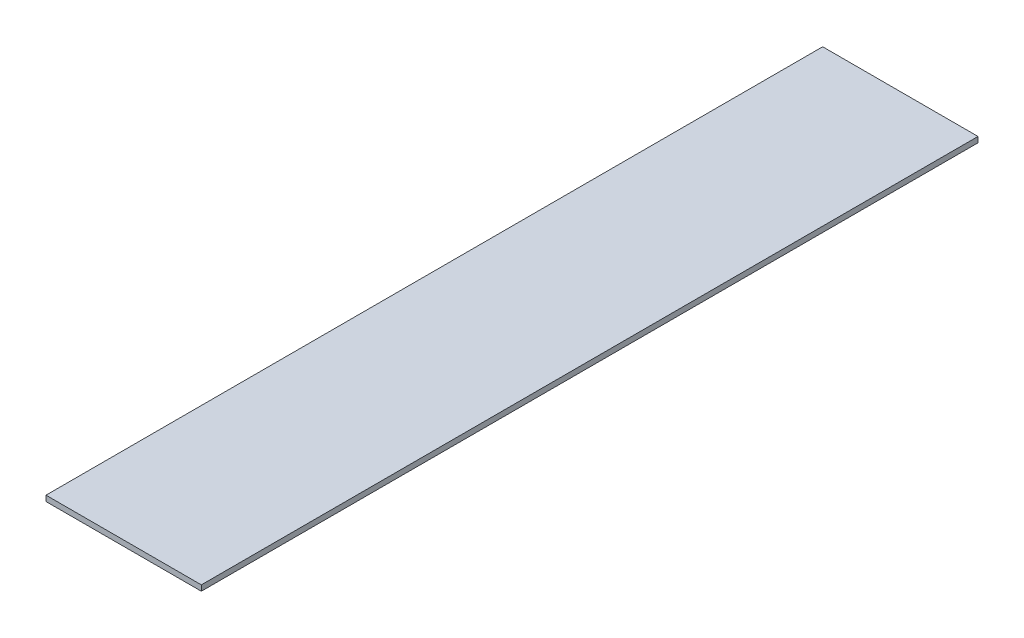
ISO-10303-21;
HEADER;
FILE_DESCRIPTION(('STEP AP214'),'2;1');
FILE_NAME('part.step','',(''),(''),'','','');
FILE_SCHEMA(('AUTOMOTIVE_DESIGN { 1 0 10303 214 1 1 1 1 }'));
ENDSEC;
DATA;
#1=APPLICATION_CONTEXT('core data for automotive mechanical design processes');
#2=APPLICATION_PROTOCOL_DEFINITION('international standard','automotive_design',2000,#1);
#3=PRODUCT_CONTEXT('',#1,'mechanical');
#4=PRODUCT('Part','Part','',(#3));
#5=PRODUCT_RELATED_PRODUCT_CATEGORY('part','',(#4));
#6=PRODUCT_DEFINITION_FORMATION('','',#4);
#7=PRODUCT_DEFINITION_CONTEXT('part definition',#1,'design');
#8=PRODUCT_DEFINITION('design','',#6,#7);
#9=PRODUCT_DEFINITION_SHAPE('','',#8);
#10=(LENGTH_UNIT() NAMED_UNIT(*) SI_UNIT(.MILLI.,.METRE.));
#11=(NAMED_UNIT(*) PLANE_ANGLE_UNIT() SI_UNIT($,.RADIAN.));
#12=(NAMED_UNIT(*) SI_UNIT($,.STERADIAN.) SOLID_ANGLE_UNIT());
#13=UNCERTAINTY_MEASURE_WITH_UNIT(LENGTH_MEASURE(1.E-05),#10,'distance_accuracy_value','');
#14=(GEOMETRIC_REPRESENTATION_CONTEXT(3) GLOBAL_UNCERTAINTY_ASSIGNED_CONTEXT((#13)) GLOBAL_UNIT_ASSIGNED_CONTEXT((#10,
#11,#12)) REPRESENTATION_CONTEXT('',''));
#15=CARTESIAN_POINT('',(0.,0.,0.));
#16=DIRECTION('',(0.,0.,1.));
#17=DIRECTION('',(1.,0.,0.));
#18=AXIS2_PLACEMENT_3D('',#15,#16,#17);
#19=CARTESIAN_POINT('',(0.,12.7,0.));
#20=DIRECTION('',(1.,0.,0.));
#21=DIRECTION('',(0.,0.,-1.));
#22=AXIS2_PLACEMENT_3D('',#19,#20,#21);
#23=PLANE('',#22);
#24=DIRECTION('',(0.,0.,1.));
#25=VECTOR('',#24,1.);
#26=CARTESIAN_POINT('',(0.,0.,0.));
#27=LINE('',#26,#25);
#28=CARTESIAN_POINT('',(0.,0.,-1778.));
#29=VERTEX_POINT('',#28);
#30=CARTESIAN_POINT('',(0.,0.,0.));
#31=VERTEX_POINT('',#30);
#32=EDGE_CURVE('E98',#29,#31,#27,.T.);
#33=ORIENTED_EDGE('',*,*,#32,.T.);
#34=DIRECTION('',(0.,-1.,0.));
#35=VECTOR('',#34,1.);
#36=CARTESIAN_POINT('',(0.,12.7,0.));
#37=LINE('',#36,#35);
#38=CARTESIAN_POINT('',(0.,12.7,0.));
#39=VERTEX_POINT('',#38);
#40=EDGE_CURVE('E11',#39,#31,#37,.T.);
#41=ORIENTED_EDGE('',*,*,#40,.F.);
#42=DIRECTION('',(0.,0.,1.));
#43=VECTOR('',#42,1.);
#44=CARTESIAN_POINT('',(0.,12.7,0.));
#45=LINE('',#44,#43);
#46=CARTESIAN_POINT('',(0.,12.7,-1778.));
#47=VERTEX_POINT('',#46);
#48=EDGE_CURVE('E86',#47,#39,#45,.T.);
#49=ORIENTED_EDGE('',*,*,#48,.F.);
#50=DIRECTION('',(0.,-1.,0.));
#51=VECTOR('',#50,1.);
#52=CARTESIAN_POINT('',(0.,12.7,-1778.));
#53=LINE('',#52,#51);
#54=EDGE_CURVE('E94',#47,#29,#53,.T.);
#55=ORIENTED_EDGE('',*,*,#54,.T.);
#56=EDGE_LOOP('',(#33,#41,#49,#55));
#57=FACE_BOUND('',#56,.T.);
#58=ADVANCED_FACE('F35',(#57),#23,.F.);
#59=CARTESIAN_POINT('',(0.,12.7,0.));
#60=DIRECTION('',(0.,0.,-1.));
#61=DIRECTION('',(-1.,0.,0.));
#62=AXIS2_PLACEMENT_3D('',#59,#60,#61);
#63=PLANE('',#62);
#64=DIRECTION('',(1.,0.,0.));
#65=VECTOR('',#64,1.);
#66=CARTESIAN_POINT('',(0.,0.,0.));
#67=LINE('',#66,#65);
#68=CARTESIAN_POINT('',(355.6,0.,0.));
#69=VERTEX_POINT('',#68);
#70=EDGE_CURVE('E90',#31,#69,#67,.T.);
#71=ORIENTED_EDGE('',*,*,#70,.T.);
#72=DIRECTION('',(0.,-1.,0.));
#73=VECTOR('',#72,1.);
#74=CARTESIAN_POINT('',(355.6,12.7,0.));
#75=LINE('',#74,#73);
#76=CARTESIAN_POINT('',(355.6,12.7,0.));
#77=VERTEX_POINT('',#76);
#78=EDGE_CURVE('E43',#77,#69,#75,.T.);
#79=ORIENTED_EDGE('',*,*,#78,.F.);
#80=DIRECTION('',(1.,0.,0.));
#81=VECTOR('',#80,1.);
#82=CARTESIAN_POINT('',(0.,12.7,0.));
#83=LINE('',#82,#81);
#84=EDGE_CURVE('E81',#39,#77,#83,.T.);
#85=ORIENTED_EDGE('',*,*,#84,.F.);
#86=ORIENTED_EDGE('',*,*,#40,.T.);
#87=EDGE_LOOP('',(#71,#79,#85,#86));
#88=FACE_BOUND('',#87,.T.);
#89=ADVANCED_FACE('F89',(#88),#63,.F.);
#90=CARTESIAN_POINT('',(355.6,12.7,0.));
#91=DIRECTION('',(-1.,0.,0.));
#92=DIRECTION('',(0.,0.,1.));
#93=AXIS2_PLACEMENT_3D('',#90,#91,#92);
#94=PLANE('',#93);
#95=DIRECTION('',(0.,0.,-1.));
#96=VECTOR('',#95,1.);
#97=CARTESIAN_POINT('',(355.6,0.,0.));
#98=LINE('',#97,#96);
#99=CARTESIAN_POINT('',(355.6,0.,-1778.));
#100=VERTEX_POINT('',#99);
#101=EDGE_CURVE('E68',#69,#100,#98,.T.);
#102=ORIENTED_EDGE('',*,*,#101,.T.);
#103=DIRECTION('',(0.,-1.,0.));
#104=VECTOR('',#103,1.);
#105=CARTESIAN_POINT('',(355.6,12.7,-1778.));
#106=LINE('',#105,#104);
#107=CARTESIAN_POINT('',(355.6,12.7,-1778.));
#108=VERTEX_POINT('',#107);
#109=EDGE_CURVE('E91',#108,#100,#106,.T.);
#110=ORIENTED_EDGE('',*,*,#109,.F.);
#111=DIRECTION('',(0.,0.,-1.));
#112=VECTOR('',#111,1.);
#113=CARTESIAN_POINT('',(355.6,12.7,0.));
#114=LINE('',#113,#112);
#115=EDGE_CURVE('E84',#77,#108,#114,.T.);
#116=ORIENTED_EDGE('',*,*,#115,.F.);
#117=ORIENTED_EDGE('',*,*,#78,.T.);
#118=EDGE_LOOP('',(#102,#110,#116,#117));
#119=FACE_BOUND('',#118,.T.);
#120=ADVANCED_FACE('F92',(#119),#94,.F.);
#121=CARTESIAN_POINT('',(0.,12.7,-1778.));
#122=DIRECTION('',(0.,0.,1.));
#123=DIRECTION('',(1.,0.,0.));
#124=AXIS2_PLACEMENT_3D('',#121,#122,#123);
#125=PLANE('',#124);
#126=DIRECTION('',(-1.,0.,0.));
#127=VECTOR('',#126,1.);
#128=CARTESIAN_POINT('',(0.,0.,-1778.));
#129=LINE('',#128,#127);
#130=EDGE_CURVE('E74',#100,#29,#129,.T.);
#131=ORIENTED_EDGE('',*,*,#130,.T.);
#132=ORIENTED_EDGE('',*,*,#54,.F.);
#133=DIRECTION('',(-1.,0.,0.));
#134=VECTOR('',#133,1.);
#135=CARTESIAN_POINT('',(0.,12.7,-1778.));
#136=LINE('',#135,#134);
#137=EDGE_CURVE('E51',#108,#47,#136,.T.);
#138=ORIENTED_EDGE('',*,*,#137,.F.);
#139=ORIENTED_EDGE('',*,*,#109,.T.);
#140=EDGE_LOOP('',(#131,#132,#138,#139));
#141=FACE_BOUND('',#140,.T.);
#142=ADVANCED_FACE('F105',(#141),#125,.F.);
#143=CARTESIAN_POINT('',(0.,12.7,0.));
#144=DIRECTION('',(0.,-1.,0.));
#145=DIRECTION('',(0.,0.,-1.));
#146=AXIS2_PLACEMENT_3D('',#143,#144,#145);
#147=PLANE('',#146);
#148=ORIENTED_EDGE('',*,*,#48,.T.);
#149=ORIENTED_EDGE('',*,*,#84,.T.);
#150=ORIENTED_EDGE('',*,*,#115,.T.);
#151=ORIENTED_EDGE('',*,*,#137,.T.);
#152=EDGE_LOOP('',(#148,#149,#150,#151));
#153=FACE_BOUND('',#152,.T.);
#154=ADVANCED_FACE('F82',(#153),#147,.F.);
#155=CARTESIAN_POINT('',(0.,0.,0.));
#156=DIRECTION('',(0.,-1.,0.));
#157=DIRECTION('',(0.,0.,-1.));
#158=AXIS2_PLACEMENT_3D('',#155,#156,#157);
#159=PLANE('',#158);
#160=ORIENTED_EDGE('',*,*,#32,.F.);
#161=ORIENTED_EDGE('',*,*,#130,.F.);
#162=ORIENTED_EDGE('',*,*,#101,.F.);
#163=ORIENTED_EDGE('',*,*,#70,.F.);
#164=EDGE_LOOP('',(#160,#161,#162,#163));
#165=FACE_BOUND('',#164,.T.);
#166=ADVANCED_FACE('F108',(#165),#159,.T.);
#167=CLOSED_SHELL('',(#58,#89,#120,#142,#154,#166));
#168=MANIFOLD_SOLID_BREP('B2',#167);
#169=ADVANCED_BREP_SHAPE_REPRESENTATION('',(#18,#168),#14);
#170=SHAPE_DEFINITION_REPRESENTATION(#9,#169);
ENDSEC;
END-ISO-10303-21;
